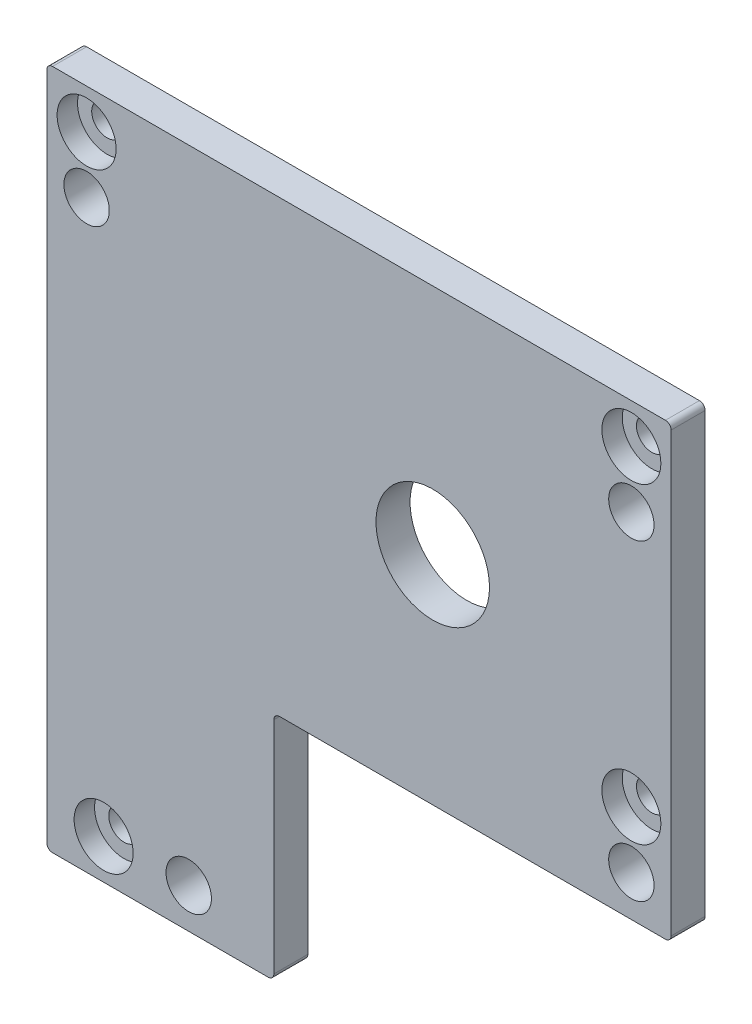
ISO-10303-21;
HEADER;
FILE_DESCRIPTION(('STEP AP214'),'2;1');
FILE_NAME('part.step','',(''),(''),'','','');
FILE_SCHEMA(('AUTOMOTIVE_DESIGN { 1 0 10303 214 1 1 1 1 }'));
ENDSEC;
DATA;
#1=APPLICATION_CONTEXT('core data for automotive mechanical design processes');
#2=APPLICATION_PROTOCOL_DEFINITION('international standard','automotive_design',2000,#1);
#3=PRODUCT_CONTEXT('',#1,'mechanical');
#4=PRODUCT('Part','Part','',(#3));
#5=PRODUCT_RELATED_PRODUCT_CATEGORY('part','',(#4));
#6=PRODUCT_DEFINITION_FORMATION('','',#4);
#7=PRODUCT_DEFINITION_CONTEXT('part definition',#1,'design');
#8=PRODUCT_DEFINITION('design','',#6,#7);
#9=PRODUCT_DEFINITION_SHAPE('','',#8);
#10=(LENGTH_UNIT() NAMED_UNIT(*) SI_UNIT(.MILLI.,.METRE.));
#11=(NAMED_UNIT(*) PLANE_ANGLE_UNIT() SI_UNIT($,.RADIAN.));
#12=(NAMED_UNIT(*) SI_UNIT($,.STERADIAN.) SOLID_ANGLE_UNIT());
#13=UNCERTAINTY_MEASURE_WITH_UNIT(LENGTH_MEASURE(1.E-05),#10,'distance_accuracy_value','');
#14=(GEOMETRIC_REPRESENTATION_CONTEXT(3) GLOBAL_UNCERTAINTY_ASSIGNED_CONTEXT((#13)) GLOBAL_UNIT_ASSIGNED_CONTEXT((#10,
#11,#12)) REPRESENTATION_CONTEXT('',''));
#15=CARTESIAN_POINT('',(0.,0.,0.));
#16=DIRECTION('',(0.,0.,1.));
#17=DIRECTION('',(1.,0.,0.));
#18=AXIS2_PLACEMENT_3D('',#15,#16,#17);
#19=CARTESIAN_POINT('',(-22.9,26.5,17.7));
#20=DIRECTION('',(0.,0.,-1.));
#21=DIRECTION('',(-1.,0.,0.));
#22=AXIS2_PLACEMENT_3D('',#19,#20,#21);
#23=PLANE('',#22);
#24=CARTESIAN_POINT('',(-24.,26.5,17.7));
#25=DIRECTION('',(0.,0.,1.));
#26=DIRECTION('',(1.,0.,0.));
#27=AXIS2_PLACEMENT_3D('',#24,#25,#26);
#28=CIRCLE('',#27,2.6);
#29=CARTESIAN_POINT('',(-21.4,26.5,17.7));
#30=VERTEX_POINT('',#29);
#31=EDGE_CURVE('E623',#30,#30,#28,.T.);
#32=ORIENTED_EDGE('',*,*,#31,.T.);
#33=EDGE_LOOP('',(#32));
#34=FACE_BOUND('',#33,.T.);
#35=CARTESIAN_POINT('',(-24.,26.5,17.7));
#36=DIRECTION('',(0.,0.,1.));
#37=DIRECTION('',(1.,0.,0.));
#38=AXIS2_PLACEMENT_3D('',#35,#36,#37);
#39=CIRCLE('',#38,1.35);
#40=CARTESIAN_POINT('',(-22.65,26.5,17.7));
#41=VERTEX_POINT('',#40);
#42=EDGE_CURVE('E568',#41,#41,#39,.T.);
#43=ORIENTED_EDGE('',*,*,#42,.F.);
#44=EDGE_LOOP('',(#43));
#45=FACE_BOUND('',#44,.T.);
#46=ADVANCED_FACE('F43',(#34,#45),#23,.F.);
#47=CARTESIAN_POINT('',(-21.4,-26.5,17.7));
#48=DIRECTION('',(0.,0.,-1.));
#49=DIRECTION('',(-1.,0.,0.));
#50=AXIS2_PLACEMENT_3D('',#47,#48,#49);
#51=PLANE('',#50);
#52=CARTESIAN_POINT('',(-22.5,-26.5,17.7));
#53=DIRECTION('',(0.,0.,1.));
#54=DIRECTION('',(1.,0.,0.));
#55=AXIS2_PLACEMENT_3D('',#52,#53,#54);
#56=CIRCLE('',#55,2.6);
#57=CARTESIAN_POINT('',(-19.9,-26.5,17.7));
#58=VERTEX_POINT('',#57);
#59=EDGE_CURVE('E245',#58,#58,#56,.T.);
#60=ORIENTED_EDGE('',*,*,#59,.T.);
#61=EDGE_LOOP('',(#60));
#62=FACE_BOUND('',#61,.T.);
#63=CARTESIAN_POINT('',(-22.5,-26.5,17.7));
#64=DIRECTION('',(0.,0.,1.));
#65=DIRECTION('',(1.,0.,0.));
#66=AXIS2_PLACEMENT_3D('',#63,#64,#65);
#67=CIRCLE('',#66,1.35);
#68=CARTESIAN_POINT('',(-21.15,-26.5,17.7));
#69=VERTEX_POINT('',#68);
#70=EDGE_CURVE('E574',#69,#69,#67,.T.);
#71=ORIENTED_EDGE('',*,*,#70,.F.);
#72=EDGE_LOOP('',(#71));
#73=FACE_BOUND('',#72,.T.);
#74=ADVANCED_FACE('F279',(#62,#73),#51,.F.);
#75=CARTESIAN_POINT('',(-27.5,30.,19.5));
#76=DIRECTION('',(1.,0.,0.));
#77=DIRECTION('',(0.,0.,-1.));
#78=AXIS2_PLACEMENT_3D('',#75,#76,#77);
#79=PLANE('',#78);
#80=DIRECTION('',(0.,-1.,0.));
#81=VECTOR('',#80,1.);
#82=CARTESIAN_POINT('',(-27.5,30.,16.5));
#83=LINE('',#82,#81);
#84=CARTESIAN_POINT('',(-27.5,29.5,16.5));
#85=VERTEX_POINT('',#84);
#86=CARTESIAN_POINT('',(-27.5,-29.5,16.5));
#87=VERTEX_POINT('',#86);
#88=EDGE_CURVE('E229',#85,#87,#83,.T.);
#89=ORIENTED_EDGE('',*,*,#88,.T.);
#90=DIRECTION('',(0.,0.,-1.));
#91=VECTOR('',#90,1.);
#92=CARTESIAN_POINT('',(-27.5,-29.5,19.5));
#93=LINE('',#92,#91);
#94=CARTESIAN_POINT('',(-27.5,-29.5,19.5));
#95=VERTEX_POINT('',#94);
#96=EDGE_CURVE('E214',#87,#95,#93,.F.);
#97=ORIENTED_EDGE('',*,*,#96,.T.);
#98=DIRECTION('',(0.,-1.,0.));
#99=VECTOR('',#98,1.);
#100=CARTESIAN_POINT('',(-27.5,30.,19.5));
#101=LINE('',#100,#99);
#102=CARTESIAN_POINT('',(-27.5,29.5,19.5));
#103=VERTEX_POINT('',#102);
#104=EDGE_CURVE('E168',#103,#95,#101,.T.);
#105=ORIENTED_EDGE('',*,*,#104,.F.);
#106=DIRECTION('',(0.,0.,-1.));
#107=VECTOR('',#106,1.);
#108=CARTESIAN_POINT('',(-27.5,29.5,19.5));
#109=LINE('',#108,#107);
#110=EDGE_CURVE('E211',#103,#85,#109,.T.);
#111=ORIENTED_EDGE('',*,*,#110,.T.);
#112=EDGE_LOOP('',(#89,#97,#105,#111));
#113=FACE_BOUND('',#112,.T.);
#114=ADVANCED_FACE('F235',(#113),#79,.F.);
#115=CARTESIAN_POINT('',(-27.5,-30.,19.5));
#116=DIRECTION('',(0.,1.,0.));
#117=DIRECTION('',(-1.,0.,0.));
#118=AXIS2_PLACEMENT_3D('',#115,#116,#117);
#119=PLANE('',#118);
#120=DIRECTION('',(1.,0.,0.));
#121=VECTOR('',#120,1.);
#122=CARTESIAN_POINT('',(-27.5,-30.,16.5));
#123=LINE('',#122,#121);
#124=CARTESIAN_POINT('',(-27.,-30.,16.5));
#125=VERTEX_POINT('',#124);
#126=CARTESIAN_POINT('',(-8.,-30.,16.5));
#127=VERTEX_POINT('',#126);
#128=EDGE_CURVE('E163',#125,#127,#123,.T.);
#129=ORIENTED_EDGE('',*,*,#128,.T.);
#130=DIRECTION('',(0.,0.,-1.));
#131=VECTOR('',#130,1.);
#132=CARTESIAN_POINT('',(-8.,-30.,19.5));
#133=LINE('',#132,#131);
#134=CARTESIAN_POINT('',(-8.,-30.,19.5));
#135=VERTEX_POINT('',#134);
#136=EDGE_CURVE('E200',#127,#135,#133,.F.);
#137=ORIENTED_EDGE('',*,*,#136,.T.);
#138=DIRECTION('',(1.,0.,0.));
#139=VECTOR('',#138,1.);
#140=CARTESIAN_POINT('',(-27.5,-30.,19.5));
#141=LINE('',#140,#139);
#142=CARTESIAN_POINT('',(-27.,-30.,19.5));
#143=VERTEX_POINT('',#142);
#144=EDGE_CURVE('E239',#143,#135,#141,.T.);
#145=ORIENTED_EDGE('',*,*,#144,.F.);
#146=DIRECTION('',(0.,0.,-1.));
#147=VECTOR('',#146,1.);
#148=CARTESIAN_POINT('',(-27.,-30.,19.5));
#149=LINE('',#148,#147);
#150=EDGE_CURVE('E197',#143,#125,#149,.T.);
#151=ORIENTED_EDGE('',*,*,#150,.T.);
#152=EDGE_LOOP('',(#129,#137,#145,#151));
#153=FACE_BOUND('',#152,.T.);
#154=ADVANCED_FACE('F258',(#153),#119,.F.);
#155=CARTESIAN_POINT('',(-7.5,-30.,19.5));
#156=DIRECTION('',(-1.,0.,0.));
#157=DIRECTION('',(0.,-1.,0.));
#158=AXIS2_PLACEMENT_3D('',#155,#156,#157);
#159=PLANE('',#158);
#160=DIRECTION('',(0.,1.,0.));
#161=VECTOR('',#160,1.);
#162=CARTESIAN_POINT('',(-7.5,-30.,16.5));
#163=LINE('',#162,#161);
#164=CARTESIAN_POINT('',(-7.5,-29.5,16.5));
#165=VERTEX_POINT('',#164);
#166=CARTESIAN_POINT('',(-7.5,-10.1,16.5));
#167=VERTEX_POINT('',#166);
#168=EDGE_CURVE('E158',#165,#167,#163,.T.);
#169=ORIENTED_EDGE('',*,*,#168,.T.);
#170=DIRECTION('',(0.,0.,-1.));
#171=VECTOR('',#170,1.);
#172=CARTESIAN_POINT('',(-7.5,-10.1,19.5));
#173=LINE('',#172,#171);
#174=CARTESIAN_POINT('',(-7.5,-10.1,19.5));
#175=VERTEX_POINT('',#174);
#176=EDGE_CURVE('E137',#167,#175,#173,.F.);
#177=ORIENTED_EDGE('',*,*,#176,.T.);
#178=DIRECTION('',(0.,1.,0.));
#179=VECTOR('',#178,1.);
#180=CARTESIAN_POINT('',(-7.5,-30.,19.5));
#181=LINE('',#180,#179);
#182=CARTESIAN_POINT('',(-7.5,-29.5,19.5));
#183=VERTEX_POINT('',#182);
#184=EDGE_CURVE('E242',#183,#175,#181,.T.);
#185=ORIENTED_EDGE('',*,*,#184,.F.);
#186=DIRECTION('',(0.,0.,-1.));
#187=VECTOR('',#186,1.);
#188=CARTESIAN_POINT('',(-7.5,-29.5,19.5));
#189=LINE('',#188,#187);
#190=EDGE_CURVE('E151',#183,#165,#189,.T.);
#191=ORIENTED_EDGE('',*,*,#190,.T.);
#192=EDGE_LOOP('',(#169,#177,#185,#191));
#193=FACE_BOUND('',#192,.T.);
#194=ADVANCED_FACE('F268',(#193),#159,.F.);
#195=CARTESIAN_POINT('',(-7.5,-9.6,19.5));
#196=DIRECTION('',(0.,1.,0.));
#197=DIRECTION('',(-1.,0.,0.));
#198=AXIS2_PLACEMENT_3D('',#195,#196,#197);
#199=PLANE('',#198);
#200=DIRECTION('',(1.,0.,0.));
#201=VECTOR('',#200,1.);
#202=CARTESIAN_POINT('',(-7.5,-9.6,19.5));
#203=LINE('',#202,#201);
#204=CARTESIAN_POINT('',(-7.,-9.6,19.5));
#205=VERTEX_POINT('',#204);
#206=CARTESIAN_POINT('',(27.,-9.6,19.5));
#207=VERTEX_POINT('',#206);
#208=EDGE_CURVE('E150',#205,#207,#203,.T.);
#209=ORIENTED_EDGE('',*,*,#208,.F.);
#210=DIRECTION('',(0.,0.,-1.));
#211=VECTOR('',#210,1.);
#212=CARTESIAN_POINT('',(-7.,-9.6,16.5));
#213=LINE('',#212,#211);
#214=CARTESIAN_POINT('',(-7.,-9.6,16.5));
#215=VERTEX_POINT('',#214);
#216=EDGE_CURVE('E136',#205,#215,#213,.T.);
#217=ORIENTED_EDGE('',*,*,#216,.T.);
#218=DIRECTION('',(1.,0.,0.));
#219=VECTOR('',#218,1.);
#220=CARTESIAN_POINT('',(-7.5,-9.6,16.5));
#221=LINE('',#220,#219);
#222=CARTESIAN_POINT('',(27.,-9.6,16.5));
#223=VERTEX_POINT('',#222);
#224=EDGE_CURVE('E147',#215,#223,#221,.T.);
#225=ORIENTED_EDGE('',*,*,#224,.T.);
#226=DIRECTION('',(0.,0.,-1.));
#227=VECTOR('',#226,1.);
#228=CARTESIAN_POINT('',(27.,-9.6,19.5));
#229=LINE('',#228,#227);
#230=EDGE_CURVE('E152',#223,#207,#229,.F.);
#231=ORIENTED_EDGE('',*,*,#230,.T.);
#232=EDGE_LOOP('',(#209,#217,#225,#231));
#233=FACE_BOUND('',#232,.T.);
#234=ADVANCED_FACE('F146',(#233),#199,.F.);
#235=CARTESIAN_POINT('',(27.5,-9.6,19.5));
#236=DIRECTION('',(-1.,0.,0.));
#237=DIRECTION('',(0.,0.,1.));
#238=AXIS2_PLACEMENT_3D('',#235,#236,#237);
#239=PLANE('',#238);
#240=DIRECTION('',(0.,1.,0.));
#241=VECTOR('',#240,1.);
#242=CARTESIAN_POINT('',(27.5,-9.6,19.5));
#243=LINE('',#242,#241);
#244=CARTESIAN_POINT('',(27.5,-9.1,19.5));
#245=VERTEX_POINT('',#244);
#246=CARTESIAN_POINT('',(27.5,29.5,19.5));
#247=VERTEX_POINT('',#246);
#248=EDGE_CURVE('E251',#245,#247,#243,.T.);
#249=ORIENTED_EDGE('',*,*,#248,.F.);
#250=DIRECTION('',(0.,0.,-1.));
#251=VECTOR('',#250,1.);
#252=CARTESIAN_POINT('',(27.5,-9.1,19.5));
#253=LINE('',#252,#251);
#254=CARTESIAN_POINT('',(27.5,-9.1,16.5));
#255=VERTEX_POINT('',#254);
#256=EDGE_CURVE('E218',#245,#255,#253,.T.);
#257=ORIENTED_EDGE('',*,*,#256,.T.);
#258=DIRECTION('',(0.,1.,0.));
#259=VECTOR('',#258,1.);
#260=CARTESIAN_POINT('',(27.5,-9.6,16.5));
#261=LINE('',#260,#259);
#262=CARTESIAN_POINT('',(27.5,29.5,16.5));
#263=VERTEX_POINT('',#262);
#264=EDGE_CURVE('E157',#255,#263,#261,.T.);
#265=ORIENTED_EDGE('',*,*,#264,.T.);
#266=DIRECTION('',(0.,0.,-1.));
#267=VECTOR('',#266,1.);
#268=CARTESIAN_POINT('',(27.5,29.5,19.5));
#269=LINE('',#268,#267);
#270=EDGE_CURVE('E216',#263,#247,#269,.F.);
#271=ORIENTED_EDGE('',*,*,#270,.T.);
#272=EDGE_LOOP('',(#249,#257,#265,#271));
#273=FACE_BOUND('',#272,.T.);
#274=ADVANCED_FACE('F275',(#273),#239,.F.);
#275=CARTESIAN_POINT('',(27.5,30.,19.5));
#276=DIRECTION('',(0.,-1.,0.));
#277=DIRECTION('',(0.,0.,-1.));
#278=AXIS2_PLACEMENT_3D('',#275,#276,#277);
#279=PLANE('',#278);
#280=DIRECTION('',(-1.,0.,0.));
#281=VECTOR('',#280,1.);
#282=CARTESIAN_POINT('',(27.5,30.,19.5));
#283=LINE('',#282,#281);
#284=CARTESIAN_POINT('',(27.,30.,19.5));
#285=VERTEX_POINT('',#284);
#286=CARTESIAN_POINT('',(-27.,30.,19.5));
#287=VERTEX_POINT('',#286);
#288=EDGE_CURVE('E183',#285,#287,#283,.T.);
#289=ORIENTED_EDGE('',*,*,#288,.F.);
#290=DIRECTION('',(0.,0.,-1.));
#291=VECTOR('',#290,1.);
#292=CARTESIAN_POINT('',(27.,30.,19.5));
#293=LINE('',#292,#291);
#294=CARTESIAN_POINT('',(27.,30.,16.5));
#295=VERTEX_POINT('',#294);
#296=EDGE_CURVE('E142',#285,#295,#293,.T.);
#297=ORIENTED_EDGE('',*,*,#296,.T.);
#298=DIRECTION('',(-1.,0.,0.));
#299=VECTOR('',#298,1.);
#300=CARTESIAN_POINT('',(27.5,30.,16.5));
#301=LINE('',#300,#299);
#302=CARTESIAN_POINT('',(-27.,30.,16.5));
#303=VERTEX_POINT('',#302);
#304=EDGE_CURVE('E161',#295,#303,#301,.T.);
#305=ORIENTED_EDGE('',*,*,#304,.T.);
#306=DIRECTION('',(0.,0.,-1.));
#307=VECTOR('',#306,1.);
#308=CARTESIAN_POINT('',(-27.,30.,19.5));
#309=LINE('',#308,#307);
#310=EDGE_CURVE('E58',#303,#287,#309,.F.);
#311=ORIENTED_EDGE('',*,*,#310,.T.);
#312=EDGE_LOOP('',(#289,#297,#305,#311));
#313=FACE_BOUND('',#312,.T.);
#314=ADVANCED_FACE('F225',(#313),#279,.F.);
#315=CARTESIAN_POINT('',(0.,0.,19.5));
#316=DIRECTION('',(0.,0.,1.));
#317=DIRECTION('',(1.,0.,0.));
#318=AXIS2_PLACEMENT_3D('',#315,#316,#317);
#319=PLANE('',#318);
#320=CARTESIAN_POINT('',(24.,21.5,19.5));
#321=DIRECTION('',(0.,0.,-1.));
#322=DIRECTION('',(-1.,0.,0.));
#323=AXIS2_PLACEMENT_3D('',#320,#321,#322);
#324=CIRCLE('',#323,2.);
#325=CARTESIAN_POINT('',(22.,21.5,19.5));
#326=VERTEX_POINT('',#325);
#327=EDGE_CURVE('E583',#326,#326,#324,.T.);
#328=ORIENTED_EDGE('',*,*,#327,.T.);
#329=EDGE_LOOP('',(#328));
#330=FACE_BOUND('',#329,.T.);
#331=CARTESIAN_POINT('',(24.,-6.,19.5));
#332=DIRECTION('',(0.,0.,-1.));
#333=DIRECTION('',(-1.,0.,0.));
#334=AXIS2_PLACEMENT_3D('',#331,#332,#333);
#335=CIRCLE('',#334,2.);
#336=CARTESIAN_POINT('',(22.,-6.,19.5));
#337=VERTEX_POINT('',#336);
#338=EDGE_CURVE('E589',#337,#337,#335,.T.);
#339=ORIENTED_EDGE('',*,*,#338,.T.);
#340=EDGE_LOOP('',(#339));
#341=FACE_BOUND('',#340,.T.);
#342=CARTESIAN_POINT('',(-15.,-26.5,19.5));
#343=DIRECTION('',(0.,0.,-1.));
#344=DIRECTION('',(-1.,0.,0.));
#345=AXIS2_PLACEMENT_3D('',#342,#343,#344);
#346=CIRCLE('',#345,2.);
#347=CARTESIAN_POINT('',(-17.,-26.5,19.5));
#348=VERTEX_POINT('',#347);
#349=EDGE_CURVE('E595',#348,#348,#346,.T.);
#350=ORIENTED_EDGE('',*,*,#349,.T.);
#351=EDGE_LOOP('',(#350));
#352=FACE_BOUND('',#351,.T.);
#353=CARTESIAN_POINT('',(-24.,21.5,19.5));
#354=DIRECTION('',(0.,0.,-1.));
#355=DIRECTION('',(-1.,0.,0.));
#356=AXIS2_PLACEMENT_3D('',#353,#354,#355);
#357=CIRCLE('',#356,2.);
#358=CARTESIAN_POINT('',(-26.,21.5,19.5));
#359=VERTEX_POINT('',#358);
#360=EDGE_CURVE('E601',#359,#359,#357,.T.);
#361=ORIENTED_EDGE('',*,*,#360,.T.);
#362=EDGE_LOOP('',(#361));
#363=FACE_BOUND('',#362,.T.);
#364=CARTESIAN_POINT('',(6.5,9.5,19.5));
#365=DIRECTION('',(0.,0.,1.));
#366=DIRECTION('',(1.,0.,0.));
#367=AXIS2_PLACEMENT_3D('',#364,#365,#366);
#368=CIRCLE('',#367,5.);
#369=CARTESIAN_POINT('',(11.5,9.5,19.5));
#370=VERTEX_POINT('',#369);
#371=EDGE_CURVE('E604',#370,#370,#368,.T.);
#372=ORIENTED_EDGE('',*,*,#371,.F.);
#373=EDGE_LOOP('',(#372));
#374=FACE_BOUND('',#373,.T.);
#375=CARTESIAN_POINT('',(24.,26.5,19.5));
#376=DIRECTION('',(0.,0.,1.));
#377=DIRECTION('',(1.,0.,0.));
#378=AXIS2_PLACEMENT_3D('',#375,#376,#377);
#379=CIRCLE('',#378,2.6);
#380=CARTESIAN_POINT('',(26.6,26.5,19.5));
#381=VERTEX_POINT('',#380);
#382=EDGE_CURVE('E182',#381,#381,#379,.T.);
#383=ORIENTED_EDGE('',*,*,#382,.F.);
#384=EDGE_LOOP('',(#383));
#385=FACE_BOUND('',#384,.T.);
#386=CARTESIAN_POINT('',(-24.,26.5,19.5));
#387=DIRECTION('',(0.,0.,1.));
#388=DIRECTION('',(1.,0.,0.));
#389=AXIS2_PLACEMENT_3D('',#386,#387,#388);
#390=CIRCLE('',#389,2.6);
#391=CARTESIAN_POINT('',(-21.4,26.5,19.5));
#392=VERTEX_POINT('',#391);
#393=EDGE_CURVE('E620',#392,#392,#390,.T.);
#394=ORIENTED_EDGE('',*,*,#393,.F.);
#395=EDGE_LOOP('',(#394));
#396=FACE_BOUND('',#395,.T.);
#397=CARTESIAN_POINT('',(24.,-0.999999999999998,19.5));
#398=DIRECTION('',(0.,0.,1.));
#399=DIRECTION('',(1.,0.,0.));
#400=AXIS2_PLACEMENT_3D('',#397,#398,#399);
#401=CIRCLE('',#400,2.6);
#402=CARTESIAN_POINT('',(26.6,-0.999999999999998,19.5));
#403=VERTEX_POINT('',#402);
#404=EDGE_CURVE('E625',#403,#403,#401,.T.);
#405=ORIENTED_EDGE('',*,*,#404,.F.);
#406=EDGE_LOOP('',(#405));
#407=FACE_BOUND('',#406,.T.);
#408=CARTESIAN_POINT('',(-22.5,-26.5,19.5));
#409=DIRECTION('',(0.,0.,1.));
#410=DIRECTION('',(1.,0.,0.));
#411=AXIS2_PLACEMENT_3D('',#408,#409,#410);
#412=CIRCLE('',#411,2.6);
#413=CARTESIAN_POINT('',(-19.9,-26.5,19.5));
#414=VERTEX_POINT('',#413);
#415=EDGE_CURVE('E630',#414,#414,#412,.T.);
#416=ORIENTED_EDGE('',*,*,#415,.F.);
#417=EDGE_LOOP('',(#416));
#418=FACE_BOUND('',#417,.T.);
#419=ORIENTED_EDGE('',*,*,#144,.T.);
#420=CARTESIAN_POINT('',(-8.,-29.5,19.5));
#421=DIRECTION('',(0.,0.,1.));
#422=DIRECTION('',(1.,0.,0.));
#423=AXIS2_PLACEMENT_3D('',#420,#421,#422);
#424=CIRCLE('',#423,0.5);
#425=EDGE_CURVE('E209',#135,#183,#424,.T.);
#426=ORIENTED_EDGE('',*,*,#425,.T.);
#427=ORIENTED_EDGE('',*,*,#184,.T.);
#428=CARTESIAN_POINT('',(-7.,-10.1,19.5));
#429=DIRECTION('',(0.,0.,1.));
#430=DIRECTION('',(1.,0.,0.));
#431=AXIS2_PLACEMENT_3D('',#428,#429,#430);
#432=CIRCLE('',#431,0.5);
#433=EDGE_CURVE('E11',#175,#205,#432,.F.);
#434=ORIENTED_EDGE('',*,*,#433,.T.);
#435=ORIENTED_EDGE('',*,*,#208,.T.);
#436=CARTESIAN_POINT('',(27.,-9.1,19.5));
#437=DIRECTION('',(0.,0.,1.));
#438=DIRECTION('',(1.,0.,0.));
#439=AXIS2_PLACEMENT_3D('',#436,#437,#438);
#440=CIRCLE('',#439,0.5);
#441=EDGE_CURVE('E205',#207,#245,#440,.T.);
#442=ORIENTED_EDGE('',*,*,#441,.T.);
#443=ORIENTED_EDGE('',*,*,#248,.T.);
#444=CARTESIAN_POINT('',(27.,29.5,19.5));
#445=DIRECTION('',(0.,0.,1.));
#446=DIRECTION('',(1.,0.,0.));
#447=AXIS2_PLACEMENT_3D('',#444,#445,#446);
#448=CIRCLE('',#447,0.5);
#449=EDGE_CURVE('E65',#247,#285,#448,.T.);
#450=ORIENTED_EDGE('',*,*,#449,.T.);
#451=ORIENTED_EDGE('',*,*,#288,.T.);
#452=CARTESIAN_POINT('',(-27.,29.5,19.5));
#453=DIRECTION('',(0.,0.,1.));
#454=DIRECTION('',(1.,0.,0.));
#455=AXIS2_PLACEMENT_3D('',#452,#453,#454);
#456=CIRCLE('',#455,0.5);
#457=EDGE_CURVE('E202',#287,#103,#456,.T.);
#458=ORIENTED_EDGE('',*,*,#457,.T.);
#459=ORIENTED_EDGE('',*,*,#104,.T.);
#460=CARTESIAN_POINT('',(-27.,-29.5,19.5));
#461=DIRECTION('',(0.,0.,1.));
#462=DIRECTION('',(1.,0.,0.));
#463=AXIS2_PLACEMENT_3D('',#460,#461,#462);
#464=CIRCLE('',#463,0.5);
#465=EDGE_CURVE('E207',#95,#143,#464,.T.);
#466=ORIENTED_EDGE('',*,*,#465,.T.);
#467=EDGE_LOOP('',(#419,#426,#427,#434,#435,#442,#443,#450,#451,#458,#459,#466));
#468=FACE_BOUND('',#467,.T.);
#469=ADVANCED_FACE('F266',(#330,#341,#352,#363,#374,#385,#396,#407,#418,#468),#319,.T.);
#470=CARTESIAN_POINT('',(0.,0.,16.5));
#471=DIRECTION('',(0.,0.,1.));
#472=DIRECTION('',(1.,0.,0.));
#473=AXIS2_PLACEMENT_3D('',#470,#471,#472);
#474=PLANE('',#473);
#475=CARTESIAN_POINT('',(24.,26.5,16.5));
#476=DIRECTION('',(0.,0.,1.));
#477=DIRECTION('',(1.,0.,0.));
#478=AXIS2_PLACEMENT_3D('',#475,#476,#477);
#479=CIRCLE('',#478,1.35);
#480=CARTESIAN_POINT('',(25.35,26.5,16.5));
#481=VERTEX_POINT('',#480);
#482=EDGE_CURVE('E555',#481,#481,#479,.T.);
#483=ORIENTED_EDGE('',*,*,#482,.T.);
#484=EDGE_LOOP('',(#483));
#485=FACE_BOUND('',#484,.T.);
#486=CARTESIAN_POINT('',(24.,-0.999999999999998,16.5));
#487=DIRECTION('',(0.,0.,1.));
#488=DIRECTION('',(1.,0.,0.));
#489=AXIS2_PLACEMENT_3D('',#486,#487,#488);
#490=CIRCLE('',#489,1.35);
#491=CARTESIAN_POINT('',(25.35,-0.999999999999998,16.5));
#492=VERTEX_POINT('',#491);
#493=EDGE_CURVE('E565',#492,#492,#490,.T.);
#494=ORIENTED_EDGE('',*,*,#493,.T.);
#495=EDGE_LOOP('',(#494));
#496=FACE_BOUND('',#495,.T.);
#497=CARTESIAN_POINT('',(-24.,26.5,16.5));
#498=DIRECTION('',(0.,0.,1.));
#499=DIRECTION('',(1.,0.,0.));
#500=AXIS2_PLACEMENT_3D('',#497,#498,#499);
#501=CIRCLE('',#500,1.35);
#502=CARTESIAN_POINT('',(-22.65,26.5,16.5));
#503=VERTEX_POINT('',#502);
#504=EDGE_CURVE('E571',#503,#503,#501,.T.);
#505=ORIENTED_EDGE('',*,*,#504,.T.);
#506=EDGE_LOOP('',(#505));
#507=FACE_BOUND('',#506,.T.);
#508=CARTESIAN_POINT('',(-22.5,-26.5,16.5));
#509=DIRECTION('',(0.,0.,1.));
#510=DIRECTION('',(1.,0.,0.));
#511=AXIS2_PLACEMENT_3D('',#508,#509,#510);
#512=CIRCLE('',#511,1.35);
#513=CARTESIAN_POINT('',(-21.15,-26.5,16.5));
#514=VERTEX_POINT('',#513);
#515=EDGE_CURVE('E577',#514,#514,#512,.T.);
#516=ORIENTED_EDGE('',*,*,#515,.T.);
#517=EDGE_LOOP('',(#516));
#518=FACE_BOUND('',#517,.T.);
#519=CARTESIAN_POINT('',(24.,21.5,16.5));
#520=DIRECTION('',(0.,0.,-1.));
#521=DIRECTION('',(-1.,0.,0.));
#522=AXIS2_PLACEMENT_3D('',#519,#520,#521);
#523=CIRCLE('',#522,2.);
#524=CARTESIAN_POINT('',(22.,21.5,16.5));
#525=VERTEX_POINT('',#524);
#526=EDGE_CURVE('E580',#525,#525,#523,.T.);
#527=ORIENTED_EDGE('',*,*,#526,.F.);
#528=EDGE_LOOP('',(#527));
#529=FACE_BOUND('',#528,.T.);
#530=CARTESIAN_POINT('',(24.,-6.,16.5));
#531=DIRECTION('',(0.,0.,-1.));
#532=DIRECTION('',(-1.,0.,0.));
#533=AXIS2_PLACEMENT_3D('',#530,#531,#532);
#534=CIRCLE('',#533,2.);
#535=CARTESIAN_POINT('',(22.,-6.,16.5));
#536=VERTEX_POINT('',#535);
#537=EDGE_CURVE('E586',#536,#536,#534,.T.);
#538=ORIENTED_EDGE('',*,*,#537,.F.);
#539=EDGE_LOOP('',(#538));
#540=FACE_BOUND('',#539,.T.);
#541=CARTESIAN_POINT('',(-15.,-26.5,16.5));
#542=DIRECTION('',(0.,0.,-1.));
#543=DIRECTION('',(-1.,0.,0.));
#544=AXIS2_PLACEMENT_3D('',#541,#542,#543);
#545=CIRCLE('',#544,2.);
#546=CARTESIAN_POINT('',(-17.,-26.5,16.5));
#547=VERTEX_POINT('',#546);
#548=EDGE_CURVE('E592',#547,#547,#545,.T.);
#549=ORIENTED_EDGE('',*,*,#548,.F.);
#550=EDGE_LOOP('',(#549));
#551=FACE_BOUND('',#550,.T.);
#552=CARTESIAN_POINT('',(-24.,21.5,16.5));
#553=DIRECTION('',(0.,0.,-1.));
#554=DIRECTION('',(-1.,0.,0.));
#555=AXIS2_PLACEMENT_3D('',#552,#553,#554);
#556=CIRCLE('',#555,2.);
#557=CARTESIAN_POINT('',(-26.,21.5,16.5));
#558=VERTEX_POINT('',#557);
#559=EDGE_CURVE('E598',#558,#558,#556,.T.);
#560=ORIENTED_EDGE('',*,*,#559,.F.);
#561=EDGE_LOOP('',(#560));
#562=FACE_BOUND('',#561,.T.);
#563=CARTESIAN_POINT('',(6.5,9.5,16.5));
#564=DIRECTION('',(0.,0.,1.));
#565=DIRECTION('',(1.,0.,0.));
#566=AXIS2_PLACEMENT_3D('',#563,#564,#565);
#567=CIRCLE('',#566,5.);
#568=CARTESIAN_POINT('',(11.5,9.5,16.5));
#569=VERTEX_POINT('',#568);
#570=EDGE_CURVE('E179',#569,#569,#567,.F.);
#571=ORIENTED_EDGE('',*,*,#570,.F.);
#572=EDGE_LOOP('',(#571));
#573=FACE_BOUND('',#572,.T.);
#574=CARTESIAN_POINT('',(-12.5490566211803,13.6693454933678,16.5));
#575=DIRECTION('',(0.,0.,1.));
#576=DIRECTION('',(1.,0.,0.));
#577=AXIS2_PLACEMENT_3D('',#574,#575,#576);
#578=CIRCLE('',#577,1.5);
#579=CARTESIAN_POINT('',(-11.0490566211803,13.6693454933678,16.5));
#580=VERTEX_POINT('',#579);
#581=EDGE_CURVE('E176',#580,#580,#578,.F.);
#582=ORIENTED_EDGE('',*,*,#581,.F.);
#583=EDGE_LOOP('',(#582));
#584=FACE_BOUND('',#583,.T.);
#585=CARTESIAN_POINT('',(-17.,1.98863048791795,16.5));
#586=DIRECTION('',(0.,0.,1.));
#587=DIRECTION('',(1.,0.,0.));
#588=AXIS2_PLACEMENT_3D('',#585,#586,#587);
#589=CIRCLE('',#588,1.5);
#590=CARTESIAN_POINT('',(-15.5,1.98863048791795,16.5));
#591=VERTEX_POINT('',#590);
#592=EDGE_CURVE('E172',#591,#591,#589,.F.);
#593=ORIENTED_EDGE('',*,*,#592,.F.);
#594=EDGE_LOOP('',(#593));
#595=FACE_BOUND('',#594,.T.);
#596=CARTESIAN_POINT('',(-17.5,-9.,16.5));
#597=DIRECTION('',(0.,0.,1.));
#598=DIRECTION('',(1.,0.,0.));
#599=AXIS2_PLACEMENT_3D('',#596,#597,#598);
#600=CIRCLE('',#599,1.5);
#601=CARTESIAN_POINT('',(-16.,-9.,16.5));
#602=VERTEX_POINT('',#601);
#603=EDGE_CURVE('E169',#602,#602,#600,.F.);
#604=ORIENTED_EDGE('',*,*,#603,.F.);
#605=EDGE_LOOP('',(#604));
#606=FACE_BOUND('',#605,.T.);
#607=ORIENTED_EDGE('',*,*,#168,.F.);
#608=CARTESIAN_POINT('',(-8.,-29.5,16.5));
#609=DIRECTION('',(0.,0.,1.));
#610=DIRECTION('',(1.,0.,0.));
#611=AXIS2_PLACEMENT_3D('',#608,#609,#610);
#612=CIRCLE('',#611,0.5);
#613=EDGE_CURVE('E195',#165,#127,#612,.F.);
#614=ORIENTED_EDGE('',*,*,#613,.T.);
#615=ORIENTED_EDGE('',*,*,#128,.F.);
#616=CARTESIAN_POINT('',(-27.,-29.5,16.5));
#617=DIRECTION('',(0.,0.,1.));
#618=DIRECTION('',(1.,0.,0.));
#619=AXIS2_PLACEMENT_3D('',#616,#617,#618);
#620=CIRCLE('',#619,0.5);
#621=EDGE_CURVE('E193',#125,#87,#620,.F.);
#622=ORIENTED_EDGE('',*,*,#621,.T.);
#623=ORIENTED_EDGE('',*,*,#88,.F.);
#624=CARTESIAN_POINT('',(-27.,29.5,16.5));
#625=DIRECTION('',(0.,0.,1.));
#626=DIRECTION('',(1.,0.,0.));
#627=AXIS2_PLACEMENT_3D('',#624,#625,#626);
#628=CIRCLE('',#627,0.5);
#629=EDGE_CURVE('E188',#85,#303,#628,.F.);
#630=ORIENTED_EDGE('',*,*,#629,.T.);
#631=ORIENTED_EDGE('',*,*,#304,.F.);
#632=CARTESIAN_POINT('',(27.,29.5,16.5));
#633=DIRECTION('',(0.,0.,1.));
#634=DIRECTION('',(1.,0.,0.));
#635=AXIS2_PLACEMENT_3D('',#632,#633,#634);
#636=CIRCLE('',#635,0.5);
#637=EDGE_CURVE('E190',#295,#263,#636,.F.);
#638=ORIENTED_EDGE('',*,*,#637,.T.);
#639=ORIENTED_EDGE('',*,*,#264,.F.);
#640=CARTESIAN_POINT('',(27.,-9.1,16.5));
#641=DIRECTION('',(0.,0.,1.));
#642=DIRECTION('',(1.,0.,0.));
#643=AXIS2_PLACEMENT_3D('',#640,#641,#642);
#644=CIRCLE('',#643,0.5);
#645=EDGE_CURVE('E156',#255,#223,#644,.F.);
#646=ORIENTED_EDGE('',*,*,#645,.T.);
#647=ORIENTED_EDGE('',*,*,#224,.F.);
#648=CARTESIAN_POINT('',(-7.,-10.1,16.5));
#649=DIRECTION('',(0.,0.,1.));
#650=DIRECTION('',(1.,0.,0.));
#651=AXIS2_PLACEMENT_3D('',#648,#649,#650);
#652=CIRCLE('',#651,0.5);
#653=EDGE_CURVE('E51',#215,#167,#652,.T.);
#654=ORIENTED_EDGE('',*,*,#653,.T.);
#655=EDGE_LOOP('',(#607,#614,#615,#622,#623,#630,#631,#638,#639,#646,#647,#654));
#656=FACE_BOUND('',#655,.T.);
#657=ADVANCED_FACE('F154',(#485,#496,#507,#518,#529,#540,#551,#562,#573,#584,#595,#606,#656),
#474,.F.);
#658=CARTESIAN_POINT('',(-22.5,-26.5,19.5));
#659=DIRECTION('',(0.,0.,1.));
#660=DIRECTION('',(1.,0.,0.));
#661=AXIS2_PLACEMENT_3D('',#658,#659,#660);
#662=CYLINDRICAL_SURFACE('',#661,2.6);
#663=ORIENTED_EDGE('',*,*,#59,.F.);
#664=EDGE_LOOP('',(#663));
#665=FACE_BOUND('',#664,.T.);
#666=ORIENTED_EDGE('',*,*,#415,.T.);
#667=EDGE_LOOP('',(#666));
#668=FACE_BOUND('',#667,.T.);
#669=ADVANCED_FACE('F301',(#665,#668),#662,.F.);
#670=CARTESIAN_POINT('',(25.1,-0.999999999999998,17.7));
#671=DIRECTION('',(0.,0.,-1.));
#672=DIRECTION('',(-1.,0.,0.));
#673=AXIS2_PLACEMENT_3D('',#670,#671,#672);
#674=PLANE('',#673);
#675=CARTESIAN_POINT('',(24.,-0.999999999999998,17.7));
#676=DIRECTION('',(0.,0.,1.));
#677=DIRECTION('',(1.,0.,0.));
#678=AXIS2_PLACEMENT_3D('',#675,#676,#677);
#679=CIRCLE('',#678,1.35);
#680=CARTESIAN_POINT('',(25.35,-0.999999999999998,17.7));
#681=VERTEX_POINT('',#680);
#682=EDGE_CURVE('E560',#681,#681,#679,.T.);
#683=ORIENTED_EDGE('',*,*,#682,.F.);
#684=EDGE_LOOP('',(#683));
#685=FACE_BOUND('',#684,.T.);
#686=CARTESIAN_POINT('',(24.,-0.999999999999998,17.7));
#687=DIRECTION('',(0.,0.,1.));
#688=DIRECTION('',(1.,0.,0.));
#689=AXIS2_PLACEMENT_3D('',#686,#687,#688);
#690=CIRCLE('',#689,2.6);
#691=CARTESIAN_POINT('',(26.6,-0.999999999999998,17.7));
#692=VERTEX_POINT('',#691);
#693=EDGE_CURVE('E628',#692,#692,#690,.T.);
#694=ORIENTED_EDGE('',*,*,#693,.T.);
#695=EDGE_LOOP('',(#694));
#696=FACE_BOUND('',#695,.T.);
#697=ADVANCED_FACE('F297',(#685,#696),#674,.F.);
#698=CARTESIAN_POINT('',(24.,-0.999999999999998,19.5));
#699=DIRECTION('',(0.,0.,1.));
#700=DIRECTION('',(1.,0.,0.));
#701=AXIS2_PLACEMENT_3D('',#698,#699,#700);
#702=CYLINDRICAL_SURFACE('',#701,2.6);
#703=ORIENTED_EDGE('',*,*,#693,.F.);
#704=EDGE_LOOP('',(#703));
#705=FACE_BOUND('',#704,.T.);
#706=ORIENTED_EDGE('',*,*,#404,.T.);
#707=EDGE_LOOP('',(#706));
#708=FACE_BOUND('',#707,.T.);
#709=ADVANCED_FACE('F294',(#705,#708),#702,.F.);
#710=CARTESIAN_POINT('',(-24.,26.5,19.5));
#711=DIRECTION('',(0.,0.,1.));
#712=DIRECTION('',(1.,0.,0.));
#713=AXIS2_PLACEMENT_3D('',#710,#711,#712);
#714=CYLINDRICAL_SURFACE('',#713,2.6);
#715=ORIENTED_EDGE('',*,*,#31,.F.);
#716=EDGE_LOOP('',(#715));
#717=FACE_BOUND('',#716,.T.);
#718=ORIENTED_EDGE('',*,*,#393,.T.);
#719=EDGE_LOOP('',(#718));
#720=FACE_BOUND('',#719,.T.);
#721=ADVANCED_FACE('F292',(#717,#720),#714,.F.);
#722=CARTESIAN_POINT('',(25.1,26.5,17.7));
#723=DIRECTION('',(0.,0.,-1.));
#724=DIRECTION('',(-1.,0.,0.));
#725=AXIS2_PLACEMENT_3D('',#722,#723,#724);
#726=PLANE('',#725);
#727=CARTESIAN_POINT('',(24.,26.5,17.7));
#728=DIRECTION('',(0.,0.,1.));
#729=DIRECTION('',(1.,0.,0.));
#730=AXIS2_PLACEMENT_3D('',#727,#728,#729);
#731=CIRCLE('',#730,1.35);
#732=CARTESIAN_POINT('',(25.35,26.5,17.7));
#733=VERTEX_POINT('',#732);
#734=EDGE_CURVE('E558',#733,#733,#731,.T.);
#735=ORIENTED_EDGE('',*,*,#734,.F.);
#736=EDGE_LOOP('',(#735));
#737=FACE_BOUND('',#736,.T.);
#738=CARTESIAN_POINT('',(24.,26.5,17.7));
#739=DIRECTION('',(0.,0.,1.));
#740=DIRECTION('',(1.,0.,0.));
#741=AXIS2_PLACEMENT_3D('',#738,#739,#740);
#742=CIRCLE('',#741,2.6);
#743=CARTESIAN_POINT('',(26.6,26.5,17.7));
#744=VERTEX_POINT('',#743);
#745=EDGE_CURVE('E617',#744,#744,#742,.T.);
#746=ORIENTED_EDGE('',*,*,#745,.T.);
#747=EDGE_LOOP('',(#746));
#748=FACE_BOUND('',#747,.T.);
#749=ADVANCED_FACE('F393',(#737,#748),#726,.F.);
#750=CARTESIAN_POINT('',(24.,26.5,19.5));
#751=DIRECTION('',(0.,0.,1.));
#752=DIRECTION('',(1.,0.,0.));
#753=AXIS2_PLACEMENT_3D('',#750,#751,#752);
#754=CYLINDRICAL_SURFACE('',#753,2.6);
#755=ORIENTED_EDGE('',*,*,#745,.F.);
#756=EDGE_LOOP('',(#755));
#757=FACE_BOUND('',#756,.T.);
#758=ORIENTED_EDGE('',*,*,#382,.T.);
#759=EDGE_LOOP('',(#758));
#760=FACE_BOUND('',#759,.T.);
#761=ADVANCED_FACE('F400',(#757,#760),#754,.F.);
#762=CARTESIAN_POINT('',(-17.5,-9.,17.8));
#763=DIRECTION('',(0.,0.,-1.));
#764=DIRECTION('',(-1.,0.,0.));
#765=AXIS2_PLACEMENT_3D('',#762,#763,#764);
#766=CYLINDRICAL_SURFACE('',#765,1.5);
#767=CARTESIAN_POINT('',(-17.5,-9.,17.8));
#768=DIRECTION('',(0.,0.,1.));
#769=DIRECTION('',(1.,0.,0.));
#770=AXIS2_PLACEMENT_3D('',#767,#768,#769);
#771=CIRCLE('',#770,1.5);
#772=CARTESIAN_POINT('',(-16.,-9.,17.8));
#773=VERTEX_POINT('',#772);
#774=EDGE_CURVE('E607',#773,#773,#771,.T.);
#775=ORIENTED_EDGE('',*,*,#774,.T.);
#776=EDGE_LOOP('',(#775));
#777=FACE_BOUND('',#776,.T.);
#778=ORIENTED_EDGE('',*,*,#603,.T.);
#779=EDGE_LOOP('',(#778));
#780=FACE_BOUND('',#779,.T.);
#781=ADVANCED_FACE('F407',(#777,#780),#766,.F.);
#782=CARTESIAN_POINT('',(-17.5,-9.,17.8));
#783=DIRECTION('',(0.,0.,1.));
#784=DIRECTION('',(1.,0.,0.));
#785=AXIS2_PLACEMENT_3D('',#782,#783,#784);
#786=PLANE('',#785);
#787=ORIENTED_EDGE('',*,*,#774,.F.);
#788=EDGE_LOOP('',(#787));
#789=FACE_BOUND('',#788,.T.);
#790=ADVANCED_FACE('F415',(#789),#786,.F.);
#791=CARTESIAN_POINT('',(-17.,1.98863048791795,17.8));
#792=DIRECTION('',(0.,0.,-1.));
#793=DIRECTION('',(-1.,0.,0.));
#794=AXIS2_PLACEMENT_3D('',#791,#792,#793);
#795=CYLINDRICAL_SURFACE('',#794,1.5);
#796=CARTESIAN_POINT('',(-17.,1.98863048791795,17.8));
#797=DIRECTION('',(0.,0.,1.));
#798=DIRECTION('',(1.,0.,0.));
#799=AXIS2_PLACEMENT_3D('',#796,#797,#798);
#800=CIRCLE('',#799,1.5);
#801=CARTESIAN_POINT('',(-15.5,1.98863048791795,17.8));
#802=VERTEX_POINT('',#801);
#803=EDGE_CURVE('E610',#802,#802,#800,.T.);
#804=ORIENTED_EDGE('',*,*,#803,.T.);
#805=EDGE_LOOP('',(#804));
#806=FACE_BOUND('',#805,.T.);
#807=ORIENTED_EDGE('',*,*,#592,.T.);
#808=EDGE_LOOP('',(#807));
#809=FACE_BOUND('',#808,.T.);
#810=ADVANCED_FACE('F423',(#806,#809),#795,.F.);
#811=CARTESIAN_POINT('',(-17.,1.98863048791795,17.8));
#812=DIRECTION('',(0.,0.,1.));
#813=DIRECTION('',(1.,0.,0.));
#814=AXIS2_PLACEMENT_3D('',#811,#812,#813);
#815=PLANE('',#814);
#816=ORIENTED_EDGE('',*,*,#803,.F.);
#817=EDGE_LOOP('',(#816));
#818=FACE_BOUND('',#817,.T.);
#819=ADVANCED_FACE('F431',(#818),#815,.F.);
#820=CARTESIAN_POINT('',(-12.5490566211803,13.6693454933678,17.8));
#821=DIRECTION('',(0.,0.,-1.));
#822=DIRECTION('',(-1.,0.,0.));
#823=AXIS2_PLACEMENT_3D('',#820,#821,#822);
#824=CYLINDRICAL_SURFACE('',#823,1.5);
#825=CARTESIAN_POINT('',(-12.5490566211803,13.6693454933678,17.8));
#826=DIRECTION('',(0.,0.,1.));
#827=DIRECTION('',(1.,0.,0.));
#828=AXIS2_PLACEMENT_3D('',#825,#826,#827);
#829=CIRCLE('',#828,1.5);
#830=CARTESIAN_POINT('',(-11.0490566211803,13.6693454933678,17.8));
#831=VERTEX_POINT('',#830);
#832=EDGE_CURVE('E173',#831,#831,#829,.T.);
#833=ORIENTED_EDGE('',*,*,#832,.T.);
#834=EDGE_LOOP('',(#833));
#835=FACE_BOUND('',#834,.T.);
#836=ORIENTED_EDGE('',*,*,#581,.T.);
#837=EDGE_LOOP('',(#836));
#838=FACE_BOUND('',#837,.T.);
#839=ADVANCED_FACE('F439',(#835,#838),#824,.F.);
#840=CARTESIAN_POINT('',(-12.5490566211803,13.6693454933678,17.8));
#841=DIRECTION('',(0.,0.,1.));
#842=DIRECTION('',(1.,0.,0.));
#843=AXIS2_PLACEMENT_3D('',#840,#841,#842);
#844=PLANE('',#843);
#845=ORIENTED_EDGE('',*,*,#832,.F.);
#846=EDGE_LOOP('',(#845));
#847=FACE_BOUND('',#846,.T.);
#848=ADVANCED_FACE('F447',(#847),#844,.F.);
#849=CARTESIAN_POINT('',(6.5,9.5,17.8));
#850=DIRECTION('',(0.,0.,-1.));
#851=DIRECTION('',(-1.,0.,0.));
#852=AXIS2_PLACEMENT_3D('',#849,#850,#851);
#853=CYLINDRICAL_SURFACE('',#852,5.);
#854=ORIENTED_EDGE('',*,*,#570,.T.);
#855=EDGE_LOOP('',(#854));
#856=FACE_BOUND('',#855,.T.);
#857=ORIENTED_EDGE('',*,*,#371,.T.);
#858=EDGE_LOOP('',(#857));
#859=FACE_BOUND('',#858,.T.);
#860=ADVANCED_FACE('F339',(#856,#859),#853,.F.);
#861=CARTESIAN_POINT('',(-7.,-10.1,19.5));
#862=DIRECTION('',(0.,0.,1.));
#863=DIRECTION('',(1.,0.,0.));
#864=AXIS2_PLACEMENT_3D('',#861,#862,#863);
#865=CYLINDRICAL_SURFACE('',#864,0.5);
#866=ORIENTED_EDGE('',*,*,#433,.F.);
#867=ORIENTED_EDGE('',*,*,#176,.F.);
#868=ORIENTED_EDGE('',*,*,#653,.F.);
#869=ORIENTED_EDGE('',*,*,#216,.F.);
#870=EDGE_LOOP('',(#866,#867,#868,#869));
#871=FACE_BOUND('',#870,.T.);
#872=ADVANCED_FACE('F135',(#871),#865,.F.);
#873=CARTESIAN_POINT('',(-8.,-29.5,19.5));
#874=DIRECTION('',(0.,0.,-1.));
#875=DIRECTION('',(-1.,0.,0.));
#876=AXIS2_PLACEMENT_3D('',#873,#874,#875);
#877=CYLINDRICAL_SURFACE('',#876,0.5);
#878=ORIENTED_EDGE('',*,*,#425,.F.);
#879=ORIENTED_EDGE('',*,*,#136,.F.);
#880=ORIENTED_EDGE('',*,*,#613,.F.);
#881=ORIENTED_EDGE('',*,*,#190,.F.);
#882=EDGE_LOOP('',(#878,#879,#880,#881));
#883=FACE_BOUND('',#882,.T.);
#884=ADVANCED_FACE('F263',(#883),#877,.T.);
#885=CARTESIAN_POINT('',(-27.,-29.5,19.5));
#886=DIRECTION('',(0.,0.,-1.));
#887=DIRECTION('',(-1.,0.,0.));
#888=AXIS2_PLACEMENT_3D('',#885,#886,#887);
#889=CYLINDRICAL_SURFACE('',#888,0.5);
#890=ORIENTED_EDGE('',*,*,#465,.F.);
#891=ORIENTED_EDGE('',*,*,#96,.F.);
#892=ORIENTED_EDGE('',*,*,#621,.F.);
#893=ORIENTED_EDGE('',*,*,#150,.F.);
#894=EDGE_LOOP('',(#890,#891,#892,#893));
#895=FACE_BOUND('',#894,.T.);
#896=ADVANCED_FACE('F326',(#895),#889,.T.);
#897=CARTESIAN_POINT('',(27.,-9.1,19.5));
#898=DIRECTION('',(0.,0.,-1.));
#899=DIRECTION('',(-1.,0.,0.));
#900=AXIS2_PLACEMENT_3D('',#897,#898,#899);
#901=CYLINDRICAL_SURFACE('',#900,0.5);
#902=ORIENTED_EDGE('',*,*,#441,.F.);
#903=ORIENTED_EDGE('',*,*,#230,.F.);
#904=ORIENTED_EDGE('',*,*,#645,.F.);
#905=ORIENTED_EDGE('',*,*,#256,.F.);
#906=EDGE_LOOP('',(#902,#903,#904,#905));
#907=FACE_BOUND('',#906,.T.);
#908=ADVANCED_FACE('F323',(#907),#901,.T.);
#909=CARTESIAN_POINT('',(27.,29.5,19.5));
#910=DIRECTION('',(0.,0.,-1.));
#911=DIRECTION('',(-1.,0.,0.));
#912=AXIS2_PLACEMENT_3D('',#909,#910,#911);
#913=CYLINDRICAL_SURFACE('',#912,0.5);
#914=ORIENTED_EDGE('',*,*,#449,.F.);
#915=ORIENTED_EDGE('',*,*,#270,.F.);
#916=ORIENTED_EDGE('',*,*,#637,.F.);
#917=ORIENTED_EDGE('',*,*,#296,.F.);
#918=EDGE_LOOP('',(#914,#915,#916,#917));
#919=FACE_BOUND('',#918,.T.);
#920=ADVANCED_FACE('F325',(#919),#913,.T.);
#921=CARTESIAN_POINT('',(-27.,29.5,19.5));
#922=DIRECTION('',(0.,0.,-1.));
#923=DIRECTION('',(-1.,0.,0.));
#924=AXIS2_PLACEMENT_3D('',#921,#922,#923);
#925=CYLINDRICAL_SURFACE('',#924,0.5);
#926=ORIENTED_EDGE('',*,*,#457,.F.);
#927=ORIENTED_EDGE('',*,*,#310,.F.);
#928=ORIENTED_EDGE('',*,*,#629,.F.);
#929=ORIENTED_EDGE('',*,*,#110,.F.);
#930=EDGE_LOOP('',(#926,#927,#928,#929));
#931=FACE_BOUND('',#930,.T.);
#932=ADVANCED_FACE('F45',(#931),#925,.T.);
#933=CARTESIAN_POINT('',(-24.,21.5,16.5));
#934=DIRECTION('',(0.,0.,-1.));
#935=DIRECTION('',(-1.,0.,0.));
#936=AXIS2_PLACEMENT_3D('',#933,#934,#935);
#937=CYLINDRICAL_SURFACE('',#936,2.);
#938=ORIENTED_EDGE('',*,*,#360,.F.);
#939=EDGE_LOOP('',(#938));
#940=FACE_BOUND('',#939,.T.);
#941=ORIENTED_EDGE('',*,*,#559,.T.);
#942=EDGE_LOOP('',(#941));
#943=FACE_BOUND('',#942,.T.);
#944=ADVANCED_FACE('F485',(#940,#943),#937,.F.);
#945=CARTESIAN_POINT('',(-15.,-26.5,16.5));
#946=DIRECTION('',(0.,0.,-1.));
#947=DIRECTION('',(-1.,0.,0.));
#948=AXIS2_PLACEMENT_3D('',#945,#946,#947);
#949=CYLINDRICAL_SURFACE('',#948,2.);
#950=ORIENTED_EDGE('',*,*,#349,.F.);
#951=EDGE_LOOP('',(#950));
#952=FACE_BOUND('',#951,.T.);
#953=ORIENTED_EDGE('',*,*,#548,.T.);
#954=EDGE_LOOP('',(#953));
#955=FACE_BOUND('',#954,.T.);
#956=ADVANCED_FACE('F490',(#952,#955),#949,.F.);
#957=CARTESIAN_POINT('',(24.,-6.,16.5));
#958=DIRECTION('',(0.,0.,-1.));
#959=DIRECTION('',(-1.,0.,0.));
#960=AXIS2_PLACEMENT_3D('',#957,#958,#959);
#961=CYLINDRICAL_SURFACE('',#960,2.);
#962=ORIENTED_EDGE('',*,*,#338,.F.);
#963=EDGE_LOOP('',(#962));
#964=FACE_BOUND('',#963,.T.);
#965=ORIENTED_EDGE('',*,*,#537,.T.);
#966=EDGE_LOOP('',(#965));
#967=FACE_BOUND('',#966,.T.);
#968=ADVANCED_FACE('F498',(#964,#967),#961,.F.);
#969=CARTESIAN_POINT('',(24.,21.5,16.5));
#970=DIRECTION('',(0.,0.,-1.));
#971=DIRECTION('',(-1.,0.,0.));
#972=AXIS2_PLACEMENT_3D('',#969,#970,#971);
#973=CYLINDRICAL_SURFACE('',#972,2.);
#974=ORIENTED_EDGE('',*,*,#327,.F.);
#975=EDGE_LOOP('',(#974));
#976=FACE_BOUND('',#975,.T.);
#977=ORIENTED_EDGE('',*,*,#526,.T.);
#978=EDGE_LOOP('',(#977));
#979=FACE_BOUND('',#978,.T.);
#980=ADVANCED_FACE('F506',(#976,#979),#973,.F.);
#981=CARTESIAN_POINT('',(-22.5,-26.5,17.7));
#982=DIRECTION('',(0.,0.,1.));
#983=DIRECTION('',(1.,0.,0.));
#984=AXIS2_PLACEMENT_3D('',#981,#982,#983);
#985=CYLINDRICAL_SURFACE('',#984,1.35);
#986=ORIENTED_EDGE('',*,*,#515,.F.);
#987=EDGE_LOOP('',(#986));
#988=FACE_BOUND('',#987,.T.);
#989=ORIENTED_EDGE('',*,*,#70,.T.);
#990=EDGE_LOOP('',(#989));
#991=FACE_BOUND('',#990,.T.);
#992=ADVANCED_FACE('F513',(#988,#991),#985,.F.);
#993=CARTESIAN_POINT('',(-24.,26.5,17.7));
#994=DIRECTION('',(0.,0.,1.));
#995=DIRECTION('',(1.,0.,0.));
#996=AXIS2_PLACEMENT_3D('',#993,#994,#995);
#997=CYLINDRICAL_SURFACE('',#996,1.35);
#998=ORIENTED_EDGE('',*,*,#504,.F.);
#999=EDGE_LOOP('',(#998));
#1000=FACE_BOUND('',#999,.T.);
#1001=ORIENTED_EDGE('',*,*,#42,.T.);
#1002=EDGE_LOOP('',(#1001));
#1003=FACE_BOUND('',#1002,.T.);
#1004=ADVANCED_FACE('F526',(#1000,#1003),#997,.F.);
#1005=CARTESIAN_POINT('',(24.,-0.999999999999998,17.7));
#1006=DIRECTION('',(0.,0.,1.));
#1007=DIRECTION('',(1.,0.,0.));
#1008=AXIS2_PLACEMENT_3D('',#1005,#1006,#1007);
#1009=CYLINDRICAL_SURFACE('',#1008,1.35);
#1010=ORIENTED_EDGE('',*,*,#493,.F.);
#1011=EDGE_LOOP('',(#1010));
#1012=FACE_BOUND('',#1011,.T.);
#1013=ORIENTED_EDGE('',*,*,#682,.T.);
#1014=EDGE_LOOP('',(#1013));
#1015=FACE_BOUND('',#1014,.T.);
#1016=ADVANCED_FACE('F534',(#1012,#1015),#1009,.F.);
#1017=CARTESIAN_POINT('',(24.,26.5,17.7));
#1018=DIRECTION('',(0.,0.,1.));
#1019=DIRECTION('',(1.,0.,0.));
#1020=AXIS2_PLACEMENT_3D('',#1017,#1018,#1019);
#1021=CYLINDRICAL_SURFACE('',#1020,1.35);
#1022=ORIENTED_EDGE('',*,*,#482,.F.);
#1023=EDGE_LOOP('',(#1022));
#1024=FACE_BOUND('',#1023,.T.);
#1025=ORIENTED_EDGE('',*,*,#734,.T.);
#1026=EDGE_LOOP('',(#1025));
#1027=FACE_BOUND('',#1026,.T.);
#1028=ADVANCED_FACE('F542',(#1024,#1027),#1021,.F.);
#1029=CLOSED_SHELL('',(#46,#74,#114,#154,#194,#234,#274,#314,#469,#657,#669,#697,#709,#721,#749,
#761,#781,#790,#810,#819,#839,#848,#860,#872,#884,#896,#908,#920,#932,#944,#956,#968,#980,#992,
#1004,#1016,#1028));
#1030=MANIFOLD_SOLID_BREP('B2',#1029);
#1031=ADVANCED_BREP_SHAPE_REPRESENTATION('',(#18,#1030),#14);
#1032=SHAPE_DEFINITION_REPRESENTATION(#9,#1031);
ENDSEC;
END-ISO-10303-21;
